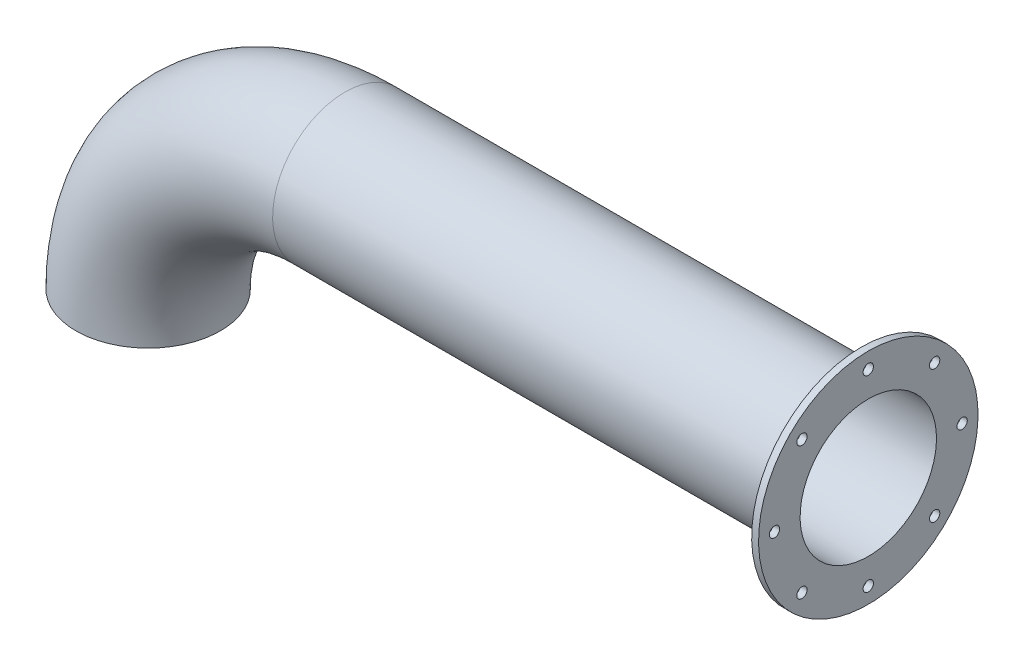
ISO-10303-21;
HEADER;
FILE_DESCRIPTION(('STEP AP214'),'2;1');
FILE_NAME('part.step','',(''),(''),'','','');
FILE_SCHEMA(('AUTOMOTIVE_DESIGN { 1 0 10303 214 1 1 1 1 }'));
ENDSEC;
DATA;
#1=APPLICATION_CONTEXT('core data for automotive mechanical design processes');
#2=APPLICATION_PROTOCOL_DEFINITION('international standard','automotive_design',2000,#1);
#3=PRODUCT_CONTEXT('',#1,'mechanical');
#4=PRODUCT('Part','Part','',(#3));
#5=PRODUCT_RELATED_PRODUCT_CATEGORY('part','',(#4));
#6=PRODUCT_DEFINITION_FORMATION('','',#4);
#7=PRODUCT_DEFINITION_CONTEXT('part definition',#1,'design');
#8=PRODUCT_DEFINITION('design','',#6,#7);
#9=PRODUCT_DEFINITION_SHAPE('','',#8);
#10=(LENGTH_UNIT() NAMED_UNIT(*) SI_UNIT(.MILLI.,.METRE.));
#11=(NAMED_UNIT(*) PLANE_ANGLE_UNIT() SI_UNIT($,.RADIAN.));
#12=(NAMED_UNIT(*) SI_UNIT($,.STERADIAN.) SOLID_ANGLE_UNIT());
#13=UNCERTAINTY_MEASURE_WITH_UNIT(LENGTH_MEASURE(1.E-05),#10,'distance_accuracy_value','');
#14=(GEOMETRIC_REPRESENTATION_CONTEXT(3) GLOBAL_UNCERTAINTY_ASSIGNED_CONTEXT((#13)) GLOBAL_UNIT_ASSIGNED_CONTEXT((#10,
#11,#12)) REPRESENTATION_CONTEXT('',''));
#15=CARTESIAN_POINT('',(0.,0.,0.));
#16=DIRECTION('',(0.,0.,1.));
#17=DIRECTION('',(1.,0.,0.));
#18=AXIS2_PLACEMENT_3D('',#15,#16,#17);
#19=CARTESIAN_POINT('',(228.6,0.,0.));
#20=DIRECTION('',(0.,0.,-1.));
#21=DIRECTION('',(-1.,0.,0.));
#22=AXIS2_PLACEMENT_3D('',#19,#20,#21);
#23=TOROIDAL_SURFACE('',#22,228.6,84.);
#24=CARTESIAN_POINT('',(0.,0.,0.));
#25=DIRECTION('',(0.,1.,0.));
#26=DIRECTION('',(0.,0.,1.));
#27=AXIS2_PLACEMENT_3D('',#24,#25,#26);
#28=CIRCLE('',#27,84.);
#29=CARTESIAN_POINT('',(-84.,0.,0.));
#30=VERTEX_POINT('',#29);
#31=EDGE_CURVE('E34',#30,#30,#28,.T.);
#32=CARTESIAN_POINT('',(228.600000000002,228.6,0.));
#33=DIRECTION('',(1.,0.,0.));
#34=DIRECTION('',(0.,0.,1.));
#35=AXIS2_PLACEMENT_3D('',#32,#33,#34);
#36=CIRCLE('',#35,84.);
#37=CARTESIAN_POINT('',(228.600000000003,312.6,0.));
#38=VERTEX_POINT('',#37);
#39=EDGE_CURVE('E43',#38,#38,#36,.T.);
#40=CARTESIAN_POINT('',(228.6,0.,0.));
#41=DIRECTION('',(0.,0.,-1.));
#42=DIRECTION('',(-1.,0.,0.));
#43=AXIS2_PLACEMENT_3D('',#40,#41,#42);
#44=CIRCLE('',#43,312.6);
#45=EDGE_CURVE('',#30,#38,#44,.T.);
#46=ORIENTED_EDGE('',*,*,#31,.T.);
#47=ORIENTED_EDGE('',*,*,#39,.F.);
#48=ORIENTED_EDGE('',*,*,#45,.T.);
#49=ORIENTED_EDGE('',*,*,#45,.F.);
#50=EDGE_LOOP('',(#46,#48,#47,#49));
#51=FACE_BOUND('',#50,.T.);
#52=ADVANCED_FACE('F31',(#51),#23,.T.);
#53=CARTESIAN_POINT('',(0.,0.,0.));
#54=DIRECTION('',(0.,1.,0.));
#55=DIRECTION('',(0.,0.,1.));
#56=AXIS2_PLACEMENT_3D('',#53,#54,#55);
#57=PLANE('',#56);
#58=CARTESIAN_POINT('',(0.,0.,0.));
#59=DIRECTION('',(0.,1.,0.));
#60=DIRECTION('',(0.,0.,1.));
#61=AXIS2_PLACEMENT_3D('',#58,#59,#60);
#62=CIRCLE('',#61,79.22);
#63=CARTESIAN_POINT('',(-79.22,0.,0.));
#64=VERTEX_POINT('',#63);
#65=EDGE_CURVE('E38',#64,#64,#62,.F.);
#66=ORIENTED_EDGE('',*,*,#65,.F.);
#67=EDGE_LOOP('',(#66));
#68=FACE_BOUND('',#67,.T.);
#69=ORIENTED_EDGE('',*,*,#31,.F.);
#70=EDGE_LOOP('',(#69));
#71=FACE_BOUND('',#70,.T.);
#72=ADVANCED_FACE('F137',(#68,#71),#57,.F.);
#73=CARTESIAN_POINT('',(228.6,0.,0.));
#74=DIRECTION('',(0.,0.,-1.));
#75=DIRECTION('',(-1.,0.,0.));
#76=AXIS2_PLACEMENT_3D('',#73,#74,#75);
#77=TOROIDAL_SURFACE('',#76,228.6,79.22);
#78=CARTESIAN_POINT('',(228.600000000002,228.6,0.));
#79=DIRECTION('',(1.,0.,0.));
#80=DIRECTION('',(0.,0.,1.));
#81=AXIS2_PLACEMENT_3D('',#78,#79,#80);
#82=CIRCLE('',#81,79.22);
#83=CARTESIAN_POINT('',(228.600000000003,307.82,0.));
#84=VERTEX_POINT('',#83);
#85=EDGE_CURVE('E10',#84,#84,#82,.F.);
#86=CARTESIAN_POINT('',(228.6,0.,0.));
#87=DIRECTION('',(0.,0.,-1.));
#88=DIRECTION('',(-1.,0.,0.));
#89=AXIS2_PLACEMENT_3D('',#86,#87,#88);
#90=CIRCLE('',#89,307.82);
#91=EDGE_CURVE('',#64,#84,#90,.T.);
#92=ORIENTED_EDGE('',*,*,#65,.T.);
#93=ORIENTED_EDGE('',*,*,#85,.F.);
#94=ORIENTED_EDGE('',*,*,#91,.T.);
#95=ORIENTED_EDGE('',*,*,#91,.F.);
#96=EDGE_LOOP('',(#92,#94,#93,#95));
#97=FACE_BOUND('',#96,.T.);
#98=ADVANCED_FACE('F135',(#97),#77,.F.);
#99=CARTESIAN_POINT('',(828.600000000002,228.599999999994,0.));
#100=DIRECTION('',(-1.,0.,0.));
#101=DIRECTION('',(0.,-1.,0.));
#102=AXIS2_PLACEMENT_3D('',#99,#100,#101);
#103=CYLINDRICAL_SURFACE('',#102,84.);
#104=CARTESIAN_POINT('',(828.600000000002,228.599999999994,0.));
#105=DIRECTION('',(1.,0.,0.));
#106=DIRECTION('',(0.,1.,0.));
#107=AXIS2_PLACEMENT_3D('',#104,#105,#106);
#108=CIRCLE('',#107,84.);
#109=CARTESIAN_POINT('',(828.600000000003,312.599999999994,0.));
#110=VERTEX_POINT('',#109);
#111=EDGE_CURVE('E50',#110,#110,#108,.T.);
#112=ORIENTED_EDGE('',*,*,#111,.F.);
#113=EDGE_LOOP('',(#112));
#114=FACE_BOUND('',#113,.T.);
#115=ORIENTED_EDGE('',*,*,#39,.T.);
#116=EDGE_LOOP('',(#115));
#117=FACE_BOUND('',#116,.T.);
#118=ADVANCED_FACE('F130',(#114,#117),#103,.T.);
#119=CARTESIAN_POINT('',(828.600000000002,228.599999999994,0.));
#120=DIRECTION('',(-1.,0.,0.));
#121=DIRECTION('',(0.,-1.,0.));
#122=AXIS2_PLACEMENT_3D('',#119,#120,#121);
#123=CYLINDRICAL_SURFACE('',#122,79.22);
#124=ORIENTED_EDGE('',*,*,#85,.T.);
#125=EDGE_LOOP('',(#124));
#126=FACE_BOUND('',#125,.T.);
#127=CARTESIAN_POINT('',(836.600000000002,228.599999999994,0.));
#128=DIRECTION('',(1.,0.,0.));
#129=DIRECTION('',(0.,1.,0.));
#130=AXIS2_PLACEMENT_3D('',#127,#128,#129);
#131=CIRCLE('',#130,79.22);
#132=CARTESIAN_POINT('',(836.600000000003,307.819999999994,0.));
#133=VERTEX_POINT('',#132);
#134=EDGE_CURVE('E62',#133,#133,#131,.T.);
#135=ORIENTED_EDGE('',*,*,#134,.T.);
#136=EDGE_LOOP('',(#135));
#137=FACE_BOUND('',#136,.T.);
#138=ADVANCED_FACE('F121',(#126,#137),#123,.F.);
#139=CARTESIAN_POINT('',(836.600000000002,228.599999999994,0.));
#140=DIRECTION('',(1.,0.,0.));
#141=DIRECTION('',(0.,1.,0.));
#142=AXIS2_PLACEMENT_3D('',#139,#140,#141);
#143=PLANE('',#142);
#144=CARTESIAN_POINT('',(836.600000000002,228.599999999987,108.999999999992));
#145=DIRECTION('',(1.,0.,0.));
#146=DIRECTION('',(0.,1.,0.));
#147=AXIS2_PLACEMENT_3D('',#144,#145,#146);
#148=CIRCLE('',#147,6.00000000000003);
#149=CARTESIAN_POINT('',(836.600000000003,234.599999999987,108.999999999992));
#150=VERTEX_POINT('',#149);
#151=EDGE_CURVE('E100',#150,#150,#148,.T.);
#152=ORIENTED_EDGE('',*,*,#151,.F.);
#153=EDGE_LOOP('',(#152));
#154=FACE_BOUND('',#153,.T.);
#155=CARTESIAN_POINT('',(836.600000000001,119.599999999994,-1.46752941072596E-11));
#156=DIRECTION('',(1.,0.,0.));
#157=DIRECTION('',(0.,1.,0.));
#158=AXIS2_PLACEMENT_3D('',#155,#156,#157);
#159=CIRCLE('',#158,6.);
#160=CARTESIAN_POINT('',(836.600000000001,125.599999999994,-1.46752941072596E-11));
#161=VERTEX_POINT('',#160);
#162=EDGE_CURVE('E88',#161,#161,#159,.T.);
#163=ORIENTED_EDGE('',*,*,#162,.F.);
#164=EDGE_LOOP('',(#163));
#165=FACE_BOUND('',#164,.T.);
#166=CARTESIAN_POINT('',(836.600000000002,228.600000000001,-109.000000000008));
#167=DIRECTION('',(1.,0.,0.));
#168=DIRECTION('',(0.,1.,0.));
#169=AXIS2_PLACEMENT_3D('',#166,#167,#168);
#170=CIRCLE('',#169,6.00000000000002);
#171=CARTESIAN_POINT('',(836.600000000003,234.600000000001,-109.000000000008));
#172=VERTEX_POINT('',#171);
#173=EDGE_CURVE('E76',#172,#172,#170,.T.);
#174=ORIENTED_EDGE('',*,*,#173,.F.);
#175=EDGE_LOOP('',(#174));
#176=FACE_BOUND('',#175,.T.);
#177=CARTESIAN_POINT('',(836.600000000004,337.599999999994,0.));
#178=DIRECTION('',(1.,0.,0.));
#179=DIRECTION('',(0.,1.,0.));
#180=AXIS2_PLACEMENT_3D('',#177,#178,#179);
#181=CIRCLE('',#180,6.);
#182=CARTESIAN_POINT('',(836.600000000004,343.599999999994,0.));
#183=VERTEX_POINT('',#182);
#184=EDGE_CURVE('E66',#183,#183,#181,.T.);
#185=ORIENTED_EDGE('',*,*,#184,.F.);
#186=EDGE_LOOP('',(#185));
#187=FACE_BOUND('',#186,.T.);
#188=CARTESIAN_POINT('',(836.600000000002,228.599999999994,0.));
#189=DIRECTION('',(1.,0.,0.));
#190=DIRECTION('',(0.,1.,0.));
#191=AXIS2_PLACEMENT_3D('',#188,#189,#190);
#192=CIRCLE('',#191,127.5);
#193=CARTESIAN_POINT('',(836.600000000004,356.099999999994,0.));
#194=VERTEX_POINT('',#193);
#195=EDGE_CURVE('E54',#194,#194,#192,.T.);
#196=ORIENTED_EDGE('',*,*,#195,.T.);
#197=EDGE_LOOP('',(#196));
#198=FACE_BOUND('',#197,.T.);
#199=ORIENTED_EDGE('',*,*,#134,.F.);
#200=EDGE_LOOP('',(#199));
#201=FACE_BOUND('',#200,.T.);
#202=CARTESIAN_POINT('',(836.600000000003,305.674639149333,-77.074639149336));
#203=DIRECTION('',(1.,0.,0.));
#204=DIRECTION('',(0.,1.,0.));
#205=AXIS2_PLACEMENT_3D('',#202,#203,#204);
#206=CIRCLE('',#205,6.00000000000001);
#207=CARTESIAN_POINT('',(836.600000000003,311.674639149333,-77.074639149336));
#208=VERTEX_POINT('',#207);
#209=EDGE_CURVE('E70',#208,#208,#206,.T.);
#210=ORIENTED_EDGE('',*,*,#209,.F.);
#211=EDGE_LOOP('',(#210));
#212=FACE_BOUND('',#211,.T.);
#213=CARTESIAN_POINT('',(836.600000000002,151.525360850665,-77.0746391493465));
#214=DIRECTION('',(1.,0.,0.));
#215=DIRECTION('',(0.,1.,0.));
#216=AXIS2_PLACEMENT_3D('',#213,#214,#215);
#217=CIRCLE('',#216,6.00000000000002);
#218=CARTESIAN_POINT('',(836.600000000002,157.525360850665,-77.0746391493465));
#219=VERTEX_POINT('',#218);
#220=EDGE_CURVE('E82',#219,#219,#217,.T.);
#221=ORIENTED_EDGE('',*,*,#220,.F.);
#222=EDGE_LOOP('',(#221));
#223=FACE_BOUND('',#222,.T.);
#224=CARTESIAN_POINT('',(836.600000000002,151.525360850655,77.0746391493212));
#225=DIRECTION('',(1.,0.,0.));
#226=DIRECTION('',(0.,1.,0.));
#227=AXIS2_PLACEMENT_3D('',#224,#225,#226);
#228=CIRCLE('',#227,6.00000000000001);
#229=CARTESIAN_POINT('',(836.600000000002,157.525360850655,77.0746391493212));
#230=VERTEX_POINT('',#229);
#231=EDGE_CURVE('E94',#230,#230,#228,.T.);
#232=ORIENTED_EDGE('',*,*,#231,.F.);
#233=EDGE_LOOP('',(#232));
#234=FACE_BOUND('',#233,.T.);
#235=CARTESIAN_POINT('',(836.600000000003,305.674639149323,77.0746391493304));
#236=DIRECTION('',(1.,0.,0.));
#237=DIRECTION('',(0.,1.,0.));
#238=AXIS2_PLACEMENT_3D('',#235,#236,#237);
#239=CIRCLE('',#238,6.00000000000001);
#240=CARTESIAN_POINT('',(836.600000000003,311.674639149323,77.0746391493304));
#241=VERTEX_POINT('',#240);
#242=EDGE_CURVE('E106',#241,#241,#239,.T.);
#243=ORIENTED_EDGE('',*,*,#242,.F.);
#244=EDGE_LOOP('',(#243));
#245=FACE_BOUND('',#244,.T.);
#246=ADVANCED_FACE('F118',(#154,#165,#176,#187,#198,#201,#212,#223,#234,#245),#143,.T.);
#247=CARTESIAN_POINT('',(828.600000000002,228.599999999994,0.));
#248=DIRECTION('',(1.,0.,0.));
#249=DIRECTION('',(0.,1.,0.));
#250=AXIS2_PLACEMENT_3D('',#247,#248,#249);
#251=PLANE('',#250);
#252=ORIENTED_EDGE('',*,*,#111,.T.);
#253=EDGE_LOOP('',(#252));
#254=FACE_BOUND('',#253,.T.);
#255=CARTESIAN_POINT('',(828.600000000002,228.599999999994,0.));
#256=DIRECTION('',(1.,0.,0.));
#257=DIRECTION('',(0.,1.,0.));
#258=AXIS2_PLACEMENT_3D('',#255,#256,#257);
#259=CIRCLE('',#258,127.5);
#260=CARTESIAN_POINT('',(828.600000000004,356.099999999994,0.));
#261=VERTEX_POINT('',#260);
#262=EDGE_CURVE('E58',#261,#261,#259,.T.);
#263=ORIENTED_EDGE('',*,*,#262,.F.);
#264=EDGE_LOOP('',(#263));
#265=FACE_BOUND('',#264,.T.);
#266=CARTESIAN_POINT('',(828.600000000004,337.599999999994,0.));
#267=DIRECTION('',(1.,0.,0.));
#268=DIRECTION('',(0.,1.,0.));
#269=AXIS2_PLACEMENT_3D('',#266,#267,#268);
#270=CIRCLE('',#269,6.);
#271=CARTESIAN_POINT('',(828.600000000004,343.599999999994,0.));
#272=VERTEX_POINT('',#271);
#273=EDGE_CURVE('E67',#272,#272,#270,.T.);
#274=ORIENTED_EDGE('',*,*,#273,.T.);
#275=EDGE_LOOP('',(#274));
#276=FACE_BOUND('',#275,.T.);
#277=CARTESIAN_POINT('',(828.600000000003,305.674639149333,-77.074639149336));
#278=DIRECTION('',(1.,0.,0.));
#279=DIRECTION('',(0.,1.,0.));
#280=AXIS2_PLACEMENT_3D('',#277,#278,#279);
#281=CIRCLE('',#280,6.00000000000001);
#282=CARTESIAN_POINT('',(828.600000000003,311.674639149333,-77.074639149336));
#283=VERTEX_POINT('',#282);
#284=EDGE_CURVE('E73',#283,#283,#281,.T.);
#285=ORIENTED_EDGE('',*,*,#284,.T.);
#286=EDGE_LOOP('',(#285));
#287=FACE_BOUND('',#286,.T.);
#288=CARTESIAN_POINT('',(828.600000000002,228.600000000001,-109.000000000008));
#289=DIRECTION('',(1.,0.,0.));
#290=DIRECTION('',(0.,1.,0.));
#291=AXIS2_PLACEMENT_3D('',#288,#289,#290);
#292=CIRCLE('',#291,6.00000000000002);
#293=CARTESIAN_POINT('',(828.600000000003,234.600000000001,-109.000000000008));
#294=VERTEX_POINT('',#293);
#295=EDGE_CURVE('E79',#294,#294,#292,.T.);
#296=ORIENTED_EDGE('',*,*,#295,.T.);
#297=EDGE_LOOP('',(#296));
#298=FACE_BOUND('',#297,.T.);
#299=CARTESIAN_POINT('',(828.600000000002,151.525360850665,-77.0746391493465));
#300=DIRECTION('',(1.,0.,0.));
#301=DIRECTION('',(0.,1.,0.));
#302=AXIS2_PLACEMENT_3D('',#299,#300,#301);
#303=CIRCLE('',#302,6.00000000000002);
#304=CARTESIAN_POINT('',(828.600000000002,157.525360850665,-77.0746391493465));
#305=VERTEX_POINT('',#304);
#306=EDGE_CURVE('E85',#305,#305,#303,.T.);
#307=ORIENTED_EDGE('',*,*,#306,.T.);
#308=EDGE_LOOP('',(#307));
#309=FACE_BOUND('',#308,.T.);
#310=CARTESIAN_POINT('',(828.600000000001,119.599999999994,-1.46752941072596E-11));
#311=DIRECTION('',(1.,0.,0.));
#312=DIRECTION('',(0.,1.,0.));
#313=AXIS2_PLACEMENT_3D('',#310,#311,#312);
#314=CIRCLE('',#313,6.);
#315=CARTESIAN_POINT('',(828.600000000001,125.599999999994,-1.46752941072596E-11));
#316=VERTEX_POINT('',#315);
#317=EDGE_CURVE('E91',#316,#316,#314,.T.);
#318=ORIENTED_EDGE('',*,*,#317,.T.);
#319=EDGE_LOOP('',(#318));
#320=FACE_BOUND('',#319,.T.);
#321=CARTESIAN_POINT('',(828.600000000002,151.525360850655,77.0746391493212));
#322=DIRECTION('',(1.,0.,0.));
#323=DIRECTION('',(0.,1.,0.));
#324=AXIS2_PLACEMENT_3D('',#321,#322,#323);
#325=CIRCLE('',#324,6.00000000000001);
#326=CARTESIAN_POINT('',(828.600000000002,157.525360850655,77.0746391493212));
#327=VERTEX_POINT('',#326);
#328=EDGE_CURVE('E97',#327,#327,#325,.T.);
#329=ORIENTED_EDGE('',*,*,#328,.T.);
#330=EDGE_LOOP('',(#329));
#331=FACE_BOUND('',#330,.T.);
#332=CARTESIAN_POINT('',(828.600000000002,228.599999999987,108.999999999992));
#333=DIRECTION('',(1.,0.,0.));
#334=DIRECTION('',(0.,1.,0.));
#335=AXIS2_PLACEMENT_3D('',#332,#333,#334);
#336=CIRCLE('',#335,6.00000000000003);
#337=CARTESIAN_POINT('',(828.600000000003,234.599999999987,108.999999999992));
#338=VERTEX_POINT('',#337);
#339=EDGE_CURVE('E103',#338,#338,#336,.T.);
#340=ORIENTED_EDGE('',*,*,#339,.T.);
#341=EDGE_LOOP('',(#340));
#342=FACE_BOUND('',#341,.T.);
#343=CARTESIAN_POINT('',(828.600000000003,305.674639149323,77.0746391493304));
#344=DIRECTION('',(1.,0.,0.));
#345=DIRECTION('',(0.,1.,0.));
#346=AXIS2_PLACEMENT_3D('',#343,#344,#345);
#347=CIRCLE('',#346,6.00000000000001);
#348=CARTESIAN_POINT('',(828.600000000003,311.674639149323,77.0746391493304));
#349=VERTEX_POINT('',#348);
#350=EDGE_CURVE('E109',#349,#349,#347,.T.);
#351=ORIENTED_EDGE('',*,*,#350,.T.);
#352=EDGE_LOOP('',(#351));
#353=FACE_BOUND('',#352,.T.);
#354=ADVANCED_FACE('F120',(#254,#265,#276,#287,#298,#309,#320,#331,#342,#353),#251,.F.);
#355=CARTESIAN_POINT('',(836.600000000002,228.599999999994,0.));
#356=DIRECTION('',(-1.,0.,0.));
#357=DIRECTION('',(0.,-1.,0.));
#358=AXIS2_PLACEMENT_3D('',#355,#356,#357);
#359=CYLINDRICAL_SURFACE('',#358,127.5);
#360=ORIENTED_EDGE('',*,*,#195,.F.);
#361=EDGE_LOOP('',(#360));
#362=FACE_BOUND('',#361,.T.);
#363=ORIENTED_EDGE('',*,*,#262,.T.);
#364=EDGE_LOOP('',(#363));
#365=FACE_BOUND('',#364,.T.);
#366=ADVANCED_FACE('F128',(#362,#365),#359,.T.);
#367=CARTESIAN_POINT('',(836.600000000004,337.599999999994,0.));
#368=DIRECTION('',(-1.,0.,0.));
#369=DIRECTION('',(0.,-1.,0.));
#370=AXIS2_PLACEMENT_3D('',#367,#368,#369);
#371=CYLINDRICAL_SURFACE('',#370,6.);
#372=ORIENTED_EDGE('',*,*,#184,.T.);
#373=EDGE_LOOP('',(#372));
#374=FACE_BOUND('',#373,.T.);
#375=ORIENTED_EDGE('',*,*,#273,.F.);
#376=EDGE_LOOP('',(#375));
#377=FACE_BOUND('',#376,.T.);
#378=ADVANCED_FACE('F150',(#374,#377),#371,.F.);
#379=CARTESIAN_POINT('',(836.600000000003,305.674639149333,-77.074639149336));
#380=DIRECTION('',(-1.,0.,0.));
#381=DIRECTION('',(0.,-1.,0.));
#382=AXIS2_PLACEMENT_3D('',#379,#380,#381);
#383=CYLINDRICAL_SURFACE('',#382,6.00000000000001);
#384=ORIENTED_EDGE('',*,*,#209,.T.);
#385=EDGE_LOOP('',(#384));
#386=FACE_BOUND('',#385,.T.);
#387=ORIENTED_EDGE('',*,*,#284,.F.);
#388=EDGE_LOOP('',(#387));
#389=FACE_BOUND('',#388,.T.);
#390=ADVANCED_FACE('F155',(#386,#389),#383,.F.);
#391=CARTESIAN_POINT('',(836.600000000002,228.600000000001,-109.000000000008));
#392=DIRECTION('',(-1.,0.,0.));
#393=DIRECTION('',(0.,-1.,0.));
#394=AXIS2_PLACEMENT_3D('',#391,#392,#393);
#395=CYLINDRICAL_SURFACE('',#394,6.00000000000002);
#396=ORIENTED_EDGE('',*,*,#173,.T.);
#397=EDGE_LOOP('',(#396));
#398=FACE_BOUND('',#397,.T.);
#399=ORIENTED_EDGE('',*,*,#295,.F.);
#400=EDGE_LOOP('',(#399));
#401=FACE_BOUND('',#400,.T.);
#402=ADVANCED_FACE('F197',(#398,#401),#395,.F.);
#403=CARTESIAN_POINT('',(836.600000000002,151.525360850665,-77.0746391493465));
#404=DIRECTION('',(-1.,0.,0.));
#405=DIRECTION('',(0.,-1.,0.));
#406=AXIS2_PLACEMENT_3D('',#403,#404,#405);
#407=CYLINDRICAL_SURFACE('',#406,6.00000000000002);
#408=ORIENTED_EDGE('',*,*,#220,.T.);
#409=EDGE_LOOP('',(#408));
#410=FACE_BOUND('',#409,.T.);
#411=ORIENTED_EDGE('',*,*,#306,.F.);
#412=EDGE_LOOP('',(#411));
#413=FACE_BOUND('',#412,.T.);
#414=ADVANCED_FACE('F193',(#410,#413),#407,.F.);
#415=CARTESIAN_POINT('',(836.600000000001,119.599999999994,-1.46752941072596E-11));
#416=DIRECTION('',(-1.,0.,0.));
#417=DIRECTION('',(0.,-1.,0.));
#418=AXIS2_PLACEMENT_3D('',#415,#416,#417);
#419=CYLINDRICAL_SURFACE('',#418,6.);
#420=ORIENTED_EDGE('',*,*,#162,.T.);
#421=EDGE_LOOP('',(#420));
#422=FACE_BOUND('',#421,.T.);
#423=ORIENTED_EDGE('',*,*,#317,.F.);
#424=EDGE_LOOP('',(#423));
#425=FACE_BOUND('',#424,.T.);
#426=ADVANCED_FACE('F189',(#422,#425),#419,.F.);
#427=CARTESIAN_POINT('',(836.600000000002,151.525360850655,77.0746391493212));
#428=DIRECTION('',(-1.,0.,0.));
#429=DIRECTION('',(0.,-1.,0.));
#430=AXIS2_PLACEMENT_3D('',#427,#428,#429);
#431=CYLINDRICAL_SURFACE('',#430,6.00000000000001);
#432=ORIENTED_EDGE('',*,*,#231,.T.);
#433=EDGE_LOOP('',(#432));
#434=FACE_BOUND('',#433,.T.);
#435=ORIENTED_EDGE('',*,*,#328,.F.);
#436=EDGE_LOOP('',(#435));
#437=FACE_BOUND('',#436,.T.);
#438=ADVANCED_FACE('F183',(#434,#437),#431,.F.);
#439=CARTESIAN_POINT('',(836.600000000002,228.599999999987,108.999999999992));
#440=DIRECTION('',(-1.,0.,0.));
#441=DIRECTION('',(0.,-1.,0.));
#442=AXIS2_PLACEMENT_3D('',#439,#440,#441);
#443=CYLINDRICAL_SURFACE('',#442,6.00000000000003);
#444=ORIENTED_EDGE('',*,*,#151,.T.);
#445=EDGE_LOOP('',(#444));
#446=FACE_BOUND('',#445,.T.);
#447=ORIENTED_EDGE('',*,*,#339,.F.);
#448=EDGE_LOOP('',(#447));
#449=FACE_BOUND('',#448,.T.);
#450=ADVANCED_FACE('F178',(#446,#449),#443,.F.);
#451=CARTESIAN_POINT('',(836.600000000003,305.674639149323,77.0746391493304));
#452=DIRECTION('',(-1.,0.,0.));
#453=DIRECTION('',(0.,-1.,0.));
#454=AXIS2_PLACEMENT_3D('',#451,#452,#453);
#455=CYLINDRICAL_SURFACE('',#454,6.00000000000001);
#456=ORIENTED_EDGE('',*,*,#242,.T.);
#457=EDGE_LOOP('',(#456));
#458=FACE_BOUND('',#457,.T.);
#459=ORIENTED_EDGE('',*,*,#350,.F.);
#460=EDGE_LOOP('',(#459));
#461=FACE_BOUND('',#460,.T.);
#462=ADVANCED_FACE('F115',(#458,#461),#455,.F.);
#463=CLOSED_SHELL('',(#52,#72,#98,#118,#138,#246,#354,#366,#378,#390,#402,#414,#426,#438,#450,#462));
#464=MANIFOLD_SOLID_BREP('B2',#463);
#465=ADVANCED_BREP_SHAPE_REPRESENTATION('',(#18,#464),#14);
#466=SHAPE_DEFINITION_REPRESENTATION(#9,#465);
ENDSEC;
END-ISO-10303-21;
